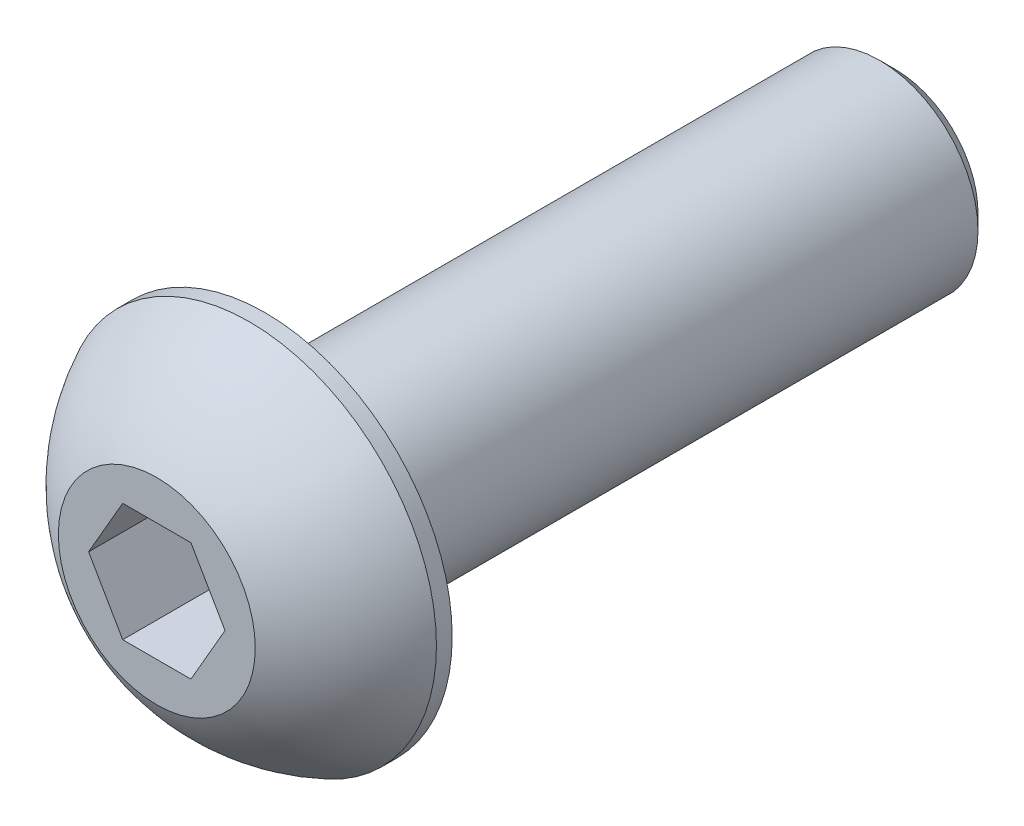
ISO-10303-21;
HEADER;
FILE_DESCRIPTION(('STEP AP214'),'2;1');
FILE_NAME('part.step','',(''),(''),'','','');
FILE_SCHEMA(('AUTOMOTIVE_DESIGN { 1 0 10303 214 1 1 1 1 }'));
ENDSEC;
DATA;
#1=APPLICATION_CONTEXT('core data for automotive mechanical design processes');
#2=APPLICATION_PROTOCOL_DEFINITION('international standard','automotive_design',2000,#1);
#3=PRODUCT_CONTEXT('',#1,'mechanical');
#4=PRODUCT('Part','Part','',(#3));
#5=PRODUCT_RELATED_PRODUCT_CATEGORY('part','',(#4));
#6=PRODUCT_DEFINITION_FORMATION('','',#4);
#7=PRODUCT_DEFINITION_CONTEXT('part definition',#1,'design');
#8=PRODUCT_DEFINITION('design','',#6,#7);
#9=PRODUCT_DEFINITION_SHAPE('','',#8);
#10=(LENGTH_UNIT() NAMED_UNIT(*) SI_UNIT(.MILLI.,.METRE.));
#11=(NAMED_UNIT(*) PLANE_ANGLE_UNIT() SI_UNIT($,.RADIAN.));
#12=(NAMED_UNIT(*) SI_UNIT($,.STERADIAN.) SOLID_ANGLE_UNIT());
#13=UNCERTAINTY_MEASURE_WITH_UNIT(LENGTH_MEASURE(1.E-05),#10,'distance_accuracy_value','');
#14=(GEOMETRIC_REPRESENTATION_CONTEXT(3) GLOBAL_UNCERTAINTY_ASSIGNED_CONTEXT((#13)) GLOBAL_UNIT_ASSIGNED_CONTEXT((#10,
#11,#12)) REPRESENTATION_CONTEXT('',''));
#15=CARTESIAN_POINT('',(0.,0.,0.));
#16=DIRECTION('',(0.,0.,1.));
#17=DIRECTION('',(1.,0.,0.));
#18=AXIS2_PLACEMENT_3D('',#15,#16,#17);
#19=CARTESIAN_POINT('',(0.,0.,-1.89574468085107));
#20=DIRECTION('',(0.,0.,-1.));
#21=DIRECTION('',(0.,-1.,0.));
#22=AXIS2_PLACEMENT_3D('',#19,#20,#21);
#23=SPHERICAL_SURFACE('',#22,5.27569366431145);
#24=CARTESIAN_POINT('',(0.,0.,2.75));
#25=DIRECTION('',(0.,0.,-1.));
#26=DIRECTION('',(0.,1.,0.));
#27=AXIS2_PLACEMENT_3D('',#24,#25,#26);
#28=CIRCLE('',#27,2.5);
#29=CARTESIAN_POINT('',(0.,-2.5,2.75));
#30=VERTEX_POINT('',#29);
#31=EDGE_CURVE('E160',#30,#30,#28,.T.);
#32=CARTESIAN_POINT('',(0.,0.,0.399999999999998));
#33=DIRECTION('',(0.,0.,-1.));
#34=DIRECTION('',(0.,1.,0.));
#35=AXIS2_PLACEMENT_3D('',#32,#33,#34);
#36=CIRCLE('',#35,4.75);
#37=CARTESIAN_POINT('',(0.,-4.75,0.399999999999997));
#38=VERTEX_POINT('',#37);
#39=EDGE_CURVE('E149',#38,#38,#36,.T.);
#40=CARTESIAN_POINT('',(0.,-2.5,2.75));
#41=CARTESIAN_POINT('',(0.,-2.53033789602055,2.73367441606806));
#42=CARTESIAN_POINT('',(0.,-2.56051583175965,2.71705158161581));
#43=CARTESIAN_POINT('',(0.,-2.6205403011397,2.68321796922811));
#44=CARTESIAN_POINT('',(0.,-2.65038683478064,2.66600719129267));
#45=CARTESIAN_POINT('',(0.,-2.7097370184291,2.63100424949599));
#46=CARTESIAN_POINT('',(0.,-2.73924066843661,2.61321208563476));
#47=CARTESIAN_POINT('',(0.,-2.79789376895629,2.57705321313237));
#48=CARTESIAN_POINT('',(0.,-2.82704321946847,2.55868650449121));
#49=CARTESIAN_POINT('',(0.,-2.88497673194048,2.52138558787606));
#50=CARTESIAN_POINT('',(0.,-2.91376079390031,2.50245137990207));
#51=CARTESIAN_POINT('',(0.,-2.97095248288814,2.46402273220713));
#52=CARTESIAN_POINT('',(0.,-2.99936010991614,2.44452829248618));
#53=CARTESIAN_POINT('',(0.,-3.05578802647536,2.40498666272869));
#54=CARTESIAN_POINT('',(0.,-3.08380831600657,2.38493947269214));
#55=CARTESIAN_POINT('',(0.,-3.13945080383732,2.34430003618386));
#56=CARTESIAN_POINT('',(0.,-3.16707300213685,2.32370778971212));
#57=CARTESIAN_POINT('',(0.,-3.22190870650379,2.28198614331494));
#58=CARTESIAN_POINT('',(0.,-3.2491222125712,2.2608567433895));
#59=CARTESIAN_POINT('',(0.,-3.30313008833608,2.21806889924031));
#60=CARTESIAN_POINT('',(0.,-3.32992445803356,2.19641045501656));
#61=CARTESIAN_POINT('',(0.,-3.38308377777572,2.15257283445953));
#62=CARTESIAN_POINT('',(0.,-3.40944872782041,2.13039365812624));
#63=CARTESIAN_POINT('',(0.,-3.46173908977993,2.08552308538976));
#64=CARTESIAN_POINT('',(0.,-3.48766450169477,2.06283168898657));
#65=CARTESIAN_POINT('',(0.,-3.53906583760554,2.01694538473199));
#66=CARTESIAN_POINT('',(0.,-3.56454176160147,1.99375047688059));
#67=CARTESIAN_POINT('',(0.,-3.6150343443922,1.94686605159161));
#68=CARTESIAN_POINT('',(0.,-3.64005100318701,1.92317653415404));
#69=CARTESIAN_POINT('',(0.,-3.68961545455247,1.87531198137855));
#70=CARTESIAN_POINT('',(0.,-3.71416324712312,1.85113694604064));
#71=CARTESIAN_POINT('',(0.,-3.76278054496115,1.8023106354849));
#72=CARTESIAN_POINT('',(0.,-3.78685005022852,1.77765936026708));
#73=CARTESIAN_POINT('',(0.,-3.83450153594043,1.72789003074574));
#74=CARTESIAN_POINT('',(0.,-3.85808351638498,1.70277197644223));
#75=CARTESIAN_POINT('',(0.,-3.90475090203651,1.65207872868666));
#76=CARTESIAN_POINT('',(0.,-3.92783630724349,1.6265035352346));
#77=CARTESIAN_POINT('',(0.,-3.97350168258337,1.57490582456228));
#78=CARTESIAN_POINT('',(0.,-3.99608165271627,1.54888330734203));
#79=CARTESIAN_POINT('',(0.,-4.04072749204997,1.49640093618993));
#80=CARTESIAN_POINT('',(0.,-4.06279336125076,1.46994108225809));
#81=CARTESIAN_POINT('',(0.,-4.10640253016652,1.41659419258275));
#82=CARTESIAN_POINT('',(0.,-4.12794582988148,1.38970715683925));
#83=CARTESIAN_POINT('',(0.,-4.17050159182639,1.33551622238665));
#84=CARTESIAN_POINT('',(0.,-4.19151405405634,1.30821232367755));
#85=CARTESIAN_POINT('',(0.,-4.23300007675915,1.25319814212539));
#86=CARTESIAN_POINT('',(0.,-4.25347363723202,1.22548785928234));
#87=CARTESIAN_POINT('',(0.,-4.29387399897277,1.16967154425898));
#88=CARTESIAN_POINT('',(0.,-4.31380080024065,1.14156551207867));
#89=CARTESIAN_POINT('',(0.,-4.35309999595547,1.08496848505712));
#90=CARTESIAN_POINT('',(0.,-4.37247239040241,1.05647749021587));
#91=CARTESIAN_POINT('',(0.,-4.4106553376554,0.999121472303362));
#92=CARTESIAN_POINT('',(0.,-4.42946589046146,0.970256449232092));
#93=CARTESIAN_POINT('',(0.,-4.46651793515379,0.912163452793535));
#94=CARTESIAN_POINT('',(0.,-4.48475942704006,0.882935479426247));
#95=CARTESIAN_POINT('',(0.,-4.52066634933005,0.824127799786568));
#96=CARTESIAN_POINT('',(0.,-4.53833177973377,0.794548093514177));
#97=CARTESIAN_POINT('',(0.,-4.57307979838923,0.735048299840633));
#98=CARTESIAN_POINT('',(0.,-4.59016238664098,0.70512821243948));
#99=CARTESIAN_POINT('',(0.,-4.62373816845238,0.644959141173841));
#100=CARTESIAN_POINT('',(0.,-4.64023136201205,0.614710157309355));
#101=CARTESIAN_POINT('',(0.,-4.6726220115181,0.553894895589104));
#102=CARTESIAN_POINT('',(0.,-4.68851946746448,0.523328617733339));
#103=CARTESIAN_POINT('',(0.,-4.71971258934309,0.461890523695328));
#104=CARTESIAN_POINT('',(0.,-4.73500825527531,0.431018707513083));
#105=CARTESIAN_POINT('',(0.,-4.75,0.399999999999997));
#106=B_SPLINE_CURVE_WITH_KNOTS('',3,(#40,#41,#42,#43,#44,#45,#46,#47,#48,#49,#50,#51,#52,#53,
#54,#55,#56,#57,#58,#59,#60,#61,#62,#63,#64,#65,#66,#67,#68,#69,#70,#71,#72,#73,#74,#75,#76,#77,
#78,#79,#80,#81,#82,#83,#84,#85,#86,#87,#88,#89,#90,#91,#92,#93,#94,#95,#96,#97,#98,#99,#100,
#101,#102,#103,#104,#105),.UNSPECIFIED.,.F.,.F.,(4,2,2,2,2,2,2,2,2,2,2,2,2,2,2,2,2,2,2,2,2,2,2,
2,2,2,2,2,2,2,2,2,4),(0.,0.103353139465309,0.206706278930619,0.310059418395928,
0.413412557861238,0.516765697326547,0.620118836791856,0.723471976257166,0.826825115722476,
0.930178255187784,1.03353139465309,1.1368845341184,1.24023767358371,1.34359081304902,
1.44694395251433,1.55029709197964,1.65365023144495,1.75700337091026,1.86035651037557,
1.96370964984088,2.06706278930619,2.1704159287715,2.27376906823681,2.37712220770212,
2.48047534716743,2.58382848663273,2.68718162609804,2.79053476556335,2.89388790502866,
2.99724104449397,3.10059418395928,3.20394732342459,3.3073004628899),.UNSPECIFIED.);
#107=EDGE_CURVE('BSEAM47',#30,#38,#106,.T.);
#108=ORIENTED_EDGE('',*,*,#31,.T.);
#109=ORIENTED_EDGE('',*,*,#39,.F.);
#110=ORIENTED_EDGE('',*,*,#107,.T.);
#111=ORIENTED_EDGE('',*,*,#107,.F.);
#112=EDGE_LOOP('',(#108,#110,#109,#111));
#113=FACE_BOUND('',#112,.T.);
#114=ADVANCED_FACE('F47',(#113),#23,.T.);
#115=CARTESIAN_POINT('',(0.,0.,2.75));
#116=DIRECTION('',(0.,0.,1.));
#117=DIRECTION('',(0.,-1.,0.));
#118=AXIS2_PLACEMENT_3D('',#115,#116,#117);
#119=PLANE('',#118);
#120=DIRECTION('',(0.5,0.866025403784439,0.));
#121=VECTOR('',#120,1.);
#122=CARTESIAN_POINT('',(0.866025403784438,-1.5,2.75));
#123=LINE('',#122,#121);
#124=CARTESIAN_POINT('',(0.866025403784438,-1.5,2.75));
#125=VERTEX_POINT('',#124);
#126=CARTESIAN_POINT('',(1.73205080756888,0.,2.75));
#127=VERTEX_POINT('',#126);
#128=EDGE_CURVE('E62',#125,#127,#123,.T.);
#129=ORIENTED_EDGE('',*,*,#128,.F.);
#130=DIRECTION('',(1.,0.,0.));
#131=VECTOR('',#130,1.);
#132=CARTESIAN_POINT('',(-0.866025403784438,-1.5,2.75));
#133=LINE('',#132,#131);
#134=CARTESIAN_POINT('',(-0.866025403784438,-1.5,2.75));
#135=VERTEX_POINT('',#134);
#136=EDGE_CURVE('E145',#135,#125,#133,.T.);
#137=ORIENTED_EDGE('',*,*,#136,.F.);
#138=DIRECTION('',(0.5,-0.866025403784438,0.));
#139=VECTOR('',#138,1.);
#140=CARTESIAN_POINT('',(-1.73205080756888,0.,2.75));
#141=LINE('',#140,#139);
#142=CARTESIAN_POINT('',(-1.73205080756888,0.,2.75));
#143=VERTEX_POINT('',#142);
#144=EDGE_CURVE('E143',#143,#135,#141,.T.);
#145=ORIENTED_EDGE('',*,*,#144,.F.);
#146=DIRECTION('',(-0.499999999999999,-0.866025403784439,0.));
#147=VECTOR('',#146,1.);
#148=CARTESIAN_POINT('',(-0.866025403784439,1.5,2.75));
#149=LINE('',#148,#147);
#150=CARTESIAN_POINT('',(-0.866025403784439,1.5,2.75));
#151=VERTEX_POINT('',#150);
#152=EDGE_CURVE('E110',#151,#143,#149,.T.);
#153=ORIENTED_EDGE('',*,*,#152,.F.);
#154=DIRECTION('',(-1.,0.,0.));
#155=VECTOR('',#154,1.);
#156=CARTESIAN_POINT('',(0.866025403784439,1.5,2.75));
#157=LINE('',#156,#155);
#158=CARTESIAN_POINT('',(0.866025403784439,1.5,2.75));
#159=VERTEX_POINT('',#158);
#160=EDGE_CURVE('E139',#159,#151,#157,.T.);
#161=ORIENTED_EDGE('',*,*,#160,.F.);
#162=DIRECTION('',(-0.5,0.866025403784439,0.));
#163=VECTOR('',#162,1.);
#164=CARTESIAN_POINT('',(1.73205080756888,0.,2.75));
#165=LINE('',#164,#163);
#166=EDGE_CURVE('E136',#127,#159,#165,.T.);
#167=ORIENTED_EDGE('',*,*,#166,.F.);
#168=EDGE_LOOP('',(#129,#137,#145,#153,#161,#167));
#169=FACE_BOUND('',#168,.T.);
#170=ORIENTED_EDGE('',*,*,#31,.F.);
#171=EDGE_LOOP('',(#170));
#172=FACE_BOUND('',#171,.T.);
#173=ADVANCED_FACE('F184',(#169,#172),#119,.T.);
#174=CARTESIAN_POINT('',(0.,-2.49999999999999,-16.));
#175=DIRECTION('',(0.,0.,-1.));
#176=DIRECTION('',(0.,1.,0.));
#177=AXIS2_PLACEMENT_3D('',#174,#175,#176);
#178=PLANE('',#177);
#179=CARTESIAN_POINT('',(0.,0.,-16.));
#180=DIRECTION('',(0.,0.,-1.));
#181=DIRECTION('',(0.,1.,0.));
#182=AXIS2_PLACEMENT_3D('',#179,#180,#181);
#183=CIRCLE('',#182,2.1);
#184=CARTESIAN_POINT('',(0.,2.1,-16.));
#185=VERTEX_POINT('',#184);
#186=EDGE_CURVE('E163',#185,#185,#183,.T.);
#187=ORIENTED_EDGE('',*,*,#186,.T.);
#188=EDGE_LOOP('',(#187));
#189=FACE_BOUND('',#188,.T.);
#190=ADVANCED_FACE('F191',(#189),#178,.T.);
#191=CARTESIAN_POINT('',(0.,0.,-16.));
#192=DIRECTION('',(0.,0.,-1.));
#193=DIRECTION('',(0.,1.,0.));
#194=AXIS2_PLACEMENT_3D('',#191,#192,#193);
#195=CYLINDRICAL_SURFACE('',#194,2.49999999999999);
#196=CARTESIAN_POINT('',(0.,0.,-0.200000000000002));
#197=DIRECTION('',(0.,0.,-1.));
#198=DIRECTION('',(0.,1.,0.));
#199=AXIS2_PLACEMENT_3D('',#196,#197,#198);
#200=CIRCLE('',#199,2.49999999999999);
#201=CARTESIAN_POINT('',(0.,2.49999999999999,-0.200000000000002));
#202=VERTEX_POINT('',#201);
#203=EDGE_CURVE('E55',#202,#202,#200,.T.);
#204=ORIENTED_EDGE('',*,*,#203,.T.);
#205=EDGE_LOOP('',(#204));
#206=FACE_BOUND('',#205,.T.);
#207=CARTESIAN_POINT('',(0.,0.,-15.6));
#208=DIRECTION('',(0.,0.,-1.));
#209=DIRECTION('',(0.,1.,0.));
#210=AXIS2_PLACEMENT_3D('',#207,#208,#209);
#211=CIRCLE('',#210,2.49999999999999);
#212=CARTESIAN_POINT('',(0.,2.5,-15.6));
#213=VERTEX_POINT('',#212);
#214=EDGE_CURVE('E166',#213,#213,#211,.F.);
#215=ORIENTED_EDGE('',*,*,#214,.T.);
#216=EDGE_LOOP('',(#215));
#217=FACE_BOUND('',#216,.T.);
#218=ADVANCED_FACE('F171',(#206,#217),#195,.T.);
#219=CARTESIAN_POINT('',(0.,-4.75,0.));
#220=DIRECTION('',(0.,0.,-1.));
#221=DIRECTION('',(0.,1.,0.));
#222=AXIS2_PLACEMENT_3D('',#219,#220,#221);
#223=PLANE('',#222);
#224=CARTESIAN_POINT('',(0.,0.,0.));
#225=DIRECTION('',(0.,0.,-1.));
#226=DIRECTION('',(0.,1.,0.));
#227=AXIS2_PLACEMENT_3D('',#224,#225,#226);
#228=CIRCLE('',#227,2.69999999999999);
#229=CARTESIAN_POINT('',(0.,2.69999999999999,0.));
#230=VERTEX_POINT('',#229);
#231=EDGE_CURVE('E11',#230,#230,#228,.F.);
#232=ORIENTED_EDGE('',*,*,#231,.T.);
#233=EDGE_LOOP('',(#232));
#234=FACE_BOUND('',#233,.T.);
#235=CARTESIAN_POINT('',(0.,0.,0.));
#236=DIRECTION('',(0.,0.,-1.));
#237=DIRECTION('',(0.,1.,0.));
#238=AXIS2_PLACEMENT_3D('',#235,#236,#237);
#239=CIRCLE('',#238,4.75);
#240=CARTESIAN_POINT('',(0.,4.74999999999999,0.));
#241=VERTEX_POINT('',#240);
#242=EDGE_CURVE('E157',#241,#241,#239,.T.);
#243=ORIENTED_EDGE('',*,*,#242,.T.);
#244=EDGE_LOOP('',(#243));
#245=FACE_BOUND('',#244,.T.);
#246=ADVANCED_FACE('F201',(#234,#245),#223,.T.);
#247=CARTESIAN_POINT('',(0.,0.,-16.));
#248=DIRECTION('',(0.,0.,-1.));
#249=DIRECTION('',(0.,1.,0.));
#250=AXIS2_PLACEMENT_3D('',#247,#248,#249);
#251=CYLINDRICAL_SURFACE('',#250,4.75);
#252=ORIENTED_EDGE('',*,*,#39,.T.);
#253=EDGE_LOOP('',(#252));
#254=FACE_BOUND('',#253,.T.);
#255=ORIENTED_EDGE('',*,*,#242,.F.);
#256=EDGE_LOOP('',(#255));
#257=FACE_BOUND('',#256,.T.);
#258=ADVANCED_FACE('F203',(#254,#257),#251,.T.);
#259=CARTESIAN_POINT('',(0.866025403784438,-1.5,-1.25));
#260=DIRECTION('',(0.866025403784439,-0.5,0.));
#261=DIRECTION('',(0.5,0.866025403784439,0.));
#262=AXIS2_PLACEMENT_3D('',#259,#260,#261);
#263=PLANE('',#262);
#264=ORIENTED_EDGE('',*,*,#128,.T.);
#265=DIRECTION('',(0.,0.,1.));
#266=VECTOR('',#265,1.);
#267=CARTESIAN_POINT('',(1.73205080756888,0.,-1.25));
#268=LINE('',#267,#266);
#269=CARTESIAN_POINT('',(1.73205080756888,0.,-1.25));
#270=VERTEX_POINT('',#269);
#271=EDGE_CURVE('E92',#270,#127,#268,.T.);
#272=ORIENTED_EDGE('',*,*,#271,.F.);
#273=DIRECTION('',(0.5,0.866025403784439,0.));
#274=VECTOR('',#273,1.);
#275=CARTESIAN_POINT('',(0.866025403784438,-1.5,-1.25));
#276=LINE('',#275,#274);
#277=CARTESIAN_POINT('',(0.866025403784438,-1.5,-1.25));
#278=VERTEX_POINT('',#277);
#279=EDGE_CURVE('E147',#278,#270,#276,.T.);
#280=ORIENTED_EDGE('',*,*,#279,.F.);
#281=DIRECTION('',(0.,0.,1.));
#282=VECTOR('',#281,1.);
#283=CARTESIAN_POINT('',(0.866025403784438,-1.5,-1.25));
#284=LINE('',#283,#282);
#285=EDGE_CURVE('E70',#278,#125,#284,.T.);
#286=ORIENTED_EDGE('',*,*,#285,.T.);
#287=EDGE_LOOP('',(#264,#272,#280,#286));
#288=FACE_BOUND('',#287,.T.);
#289=ADVANCED_FACE('F206',(#288),#263,.F.);
#290=CARTESIAN_POINT('',(-0.866025403784438,-1.5,-1.25));
#291=DIRECTION('',(0.,-1.,0.));
#292=DIRECTION('',(1.,0.,0.));
#293=AXIS2_PLACEMENT_3D('',#290,#291,#292);
#294=PLANE('',#293);
#295=ORIENTED_EDGE('',*,*,#136,.T.);
#296=ORIENTED_EDGE('',*,*,#285,.F.);
#297=DIRECTION('',(1.,0.,0.));
#298=VECTOR('',#297,1.);
#299=CARTESIAN_POINT('',(-0.866025403784438,-1.5,-1.25));
#300=LINE('',#299,#298);
#301=CARTESIAN_POINT('',(-0.866025403784438,-1.5,-1.25));
#302=VERTEX_POINT('',#301);
#303=EDGE_CURVE('E122',#302,#278,#300,.T.);
#304=ORIENTED_EDGE('',*,*,#303,.F.);
#305=DIRECTION('',(0.,0.,1.));
#306=VECTOR('',#305,1.);
#307=CARTESIAN_POINT('',(-0.866025403784438,-1.5,-1.25));
#308=LINE('',#307,#306);
#309=EDGE_CURVE('E114',#302,#135,#308,.T.);
#310=ORIENTED_EDGE('',*,*,#309,.T.);
#311=EDGE_LOOP('',(#295,#296,#304,#310));
#312=FACE_BOUND('',#311,.T.);
#313=ADVANCED_FACE('F210',(#312),#294,.F.);
#314=CARTESIAN_POINT('',(-1.73205080756888,0.,-1.25));
#315=DIRECTION('',(-0.866025403784438,-0.500000000000001,0.));
#316=DIRECTION('',(0.500000000000001,-0.866025403784438,0.));
#317=AXIS2_PLACEMENT_3D('',#314,#315,#316);
#318=PLANE('',#317);
#319=ORIENTED_EDGE('',*,*,#144,.T.);
#320=ORIENTED_EDGE('',*,*,#309,.F.);
#321=DIRECTION('',(0.5,-0.866025403784438,0.));
#322=VECTOR('',#321,1.);
#323=CARTESIAN_POINT('',(-1.73205080756888,0.,-1.25));
#324=LINE('',#323,#322);
#325=CARTESIAN_POINT('',(-1.73205080756888,0.,-1.25));
#326=VERTEX_POINT('',#325);
#327=EDGE_CURVE('E118',#326,#302,#324,.T.);
#328=ORIENTED_EDGE('',*,*,#327,.F.);
#329=DIRECTION('',(0.,0.,1.));
#330=VECTOR('',#329,1.);
#331=CARTESIAN_POINT('',(-1.73205080756888,0.,-1.25));
#332=LINE('',#331,#330);
#333=EDGE_CURVE('E103',#326,#143,#332,.T.);
#334=ORIENTED_EDGE('',*,*,#333,.T.);
#335=EDGE_LOOP('',(#319,#320,#328,#334));
#336=FACE_BOUND('',#335,.T.);
#337=ADVANCED_FACE('F119',(#336),#318,.F.);
#338=CARTESIAN_POINT('',(-0.866025403784439,1.5,-1.25));
#339=DIRECTION('',(-0.866025403784439,0.5,0.));
#340=DIRECTION('',(-0.499999999999999,-0.866025403784439,0.));
#341=AXIS2_PLACEMENT_3D('',#338,#339,#340);
#342=PLANE('',#341);
#343=ORIENTED_EDGE('',*,*,#152,.T.);
#344=ORIENTED_EDGE('',*,*,#333,.F.);
#345=DIRECTION('',(-0.499999999999999,-0.866025403784439,0.));
#346=VECTOR('',#345,1.);
#347=CARTESIAN_POINT('',(-0.866025403784439,1.5,-1.25));
#348=LINE('',#347,#346);
#349=CARTESIAN_POINT('',(-0.866025403784439,1.5,-1.25));
#350=VERTEX_POINT('',#349);
#351=EDGE_CURVE('E107',#350,#326,#348,.T.);
#352=ORIENTED_EDGE('',*,*,#351,.F.);
#353=DIRECTION('',(0.,0.,1.));
#354=VECTOR('',#353,1.);
#355=CARTESIAN_POINT('',(-0.866025403784439,1.5,-1.25));
#356=LINE('',#355,#354);
#357=EDGE_CURVE('E115',#350,#151,#356,.T.);
#358=ORIENTED_EDGE('',*,*,#357,.T.);
#359=EDGE_LOOP('',(#343,#344,#352,#358));
#360=FACE_BOUND('',#359,.T.);
#361=ADVANCED_FACE('F105',(#360),#342,.F.);
#362=CARTESIAN_POINT('',(0.866025403784439,1.5,-1.25));
#363=DIRECTION('',(0.,1.,0.));
#364=DIRECTION('',(-1.,0.,0.));
#365=AXIS2_PLACEMENT_3D('',#362,#363,#364);
#366=PLANE('',#365);
#367=ORIENTED_EDGE('',*,*,#160,.T.);
#368=ORIENTED_EDGE('',*,*,#357,.F.);
#369=DIRECTION('',(-1.,0.,0.));
#370=VECTOR('',#369,1.);
#371=CARTESIAN_POINT('',(0.866025403784439,1.5,-1.25));
#372=LINE('',#371,#370);
#373=CARTESIAN_POINT('',(0.866025403784439,1.5,-1.25));
#374=VERTEX_POINT('',#373);
#375=EDGE_CURVE('E128',#374,#350,#372,.T.);
#376=ORIENTED_EDGE('',*,*,#375,.F.);
#377=DIRECTION('',(0.,0.,1.));
#378=VECTOR('',#377,1.);
#379=CARTESIAN_POINT('',(0.866025403784439,1.5,-1.25));
#380=LINE('',#379,#378);
#381=EDGE_CURVE('E152',#374,#159,#380,.T.);
#382=ORIENTED_EDGE('',*,*,#381,.T.);
#383=EDGE_LOOP('',(#367,#368,#376,#382));
#384=FACE_BOUND('',#383,.T.);
#385=ADVANCED_FACE('F214',(#384),#366,.F.);
#386=CARTESIAN_POINT('',(1.73205080756888,0.,-1.25));
#387=DIRECTION('',(0.866025403784439,0.5,0.));
#388=DIRECTION('',(-0.5,0.866025403784439,0.));
#389=AXIS2_PLACEMENT_3D('',#386,#387,#388);
#390=PLANE('',#389);
#391=ORIENTED_EDGE('',*,*,#166,.T.);
#392=ORIENTED_EDGE('',*,*,#381,.F.);
#393=DIRECTION('',(-0.5,0.866025403784439,0.));
#394=VECTOR('',#393,1.);
#395=CARTESIAN_POINT('',(1.73205080756888,0.,-1.25));
#396=LINE('',#395,#394);
#397=EDGE_CURVE('E130',#270,#374,#396,.T.);
#398=ORIENTED_EDGE('',*,*,#397,.F.);
#399=ORIENTED_EDGE('',*,*,#271,.T.);
#400=EDGE_LOOP('',(#391,#392,#398,#399));
#401=FACE_BOUND('',#400,.T.);
#402=ADVANCED_FACE('F211',(#401),#390,.F.);
#403=CARTESIAN_POINT('',(1.73205080756888,0.,-1.25));
#404=DIRECTION('',(0.,0.,1.));
#405=DIRECTION('',(1.,0.,0.));
#406=AXIS2_PLACEMENT_3D('',#403,#404,#405);
#407=PLANE('',#406);
#408=ORIENTED_EDGE('',*,*,#279,.T.);
#409=ORIENTED_EDGE('',*,*,#397,.T.);
#410=ORIENTED_EDGE('',*,*,#375,.T.);
#411=ORIENTED_EDGE('',*,*,#351,.T.);
#412=ORIENTED_EDGE('',*,*,#327,.T.);
#413=ORIENTED_EDGE('',*,*,#303,.T.);
#414=EDGE_LOOP('',(#408,#409,#410,#411,#412,#413));
#415=FACE_BOUND('',#414,.T.);
#416=ADVANCED_FACE('F125',(#415),#407,.T.);
#417=CARTESIAN_POINT('',(0.,0.,-16.));
#418=DIRECTION('',(0.,0.,1.));
#419=DIRECTION('',(0.,-1.,0.));
#420=AXIS2_PLACEMENT_3D('',#417,#418,#419);
#421=CONICAL_SURFACE('',#420,2.1,0.785398163397448);
#422=ORIENTED_EDGE('',*,*,#214,.F.);
#423=EDGE_LOOP('',(#422));
#424=FACE_BOUND('',#423,.T.);
#425=ORIENTED_EDGE('',*,*,#186,.F.);
#426=EDGE_LOOP('',(#425));
#427=FACE_BOUND('',#426,.T.);
#428=ADVANCED_FACE('F175',(#424,#427),#421,.T.);
#429=CARTESIAN_POINT('',(0.,0.,-0.200000000000002));
#430=DIRECTION('',(0.,0.,-1.));
#431=DIRECTION('',(0.,1.,0.));
#432=AXIS2_PLACEMENT_3D('',#429,#430,#431);
#433=TOROIDAL_SURFACE('',#432,2.69999999999999,0.2);
#434=ORIENTED_EDGE('',*,*,#231,.F.);
#435=EDGE_LOOP('',(#434));
#436=FACE_BOUND('',#435,.T.);
#437=ORIENTED_EDGE('',*,*,#203,.F.);
#438=EDGE_LOOP('',(#437));
#439=FACE_BOUND('',#438,.T.);
#440=ADVANCED_FACE('F49',(#436,#439),#433,.F.);
#441=CLOSED_SHELL('',(#114,#173,#190,#218,#246,#258,#289,#313,#337,#361,#385,#402,#416,#428,#440));
#442=MANIFOLD_SOLID_BREP('B2',#441);
#443=ADVANCED_BREP_SHAPE_REPRESENTATION('',(#18,#442),#14);
#444=SHAPE_DEFINITION_REPRESENTATION(#9,#443);
ENDSEC;
END-ISO-10303-21;
